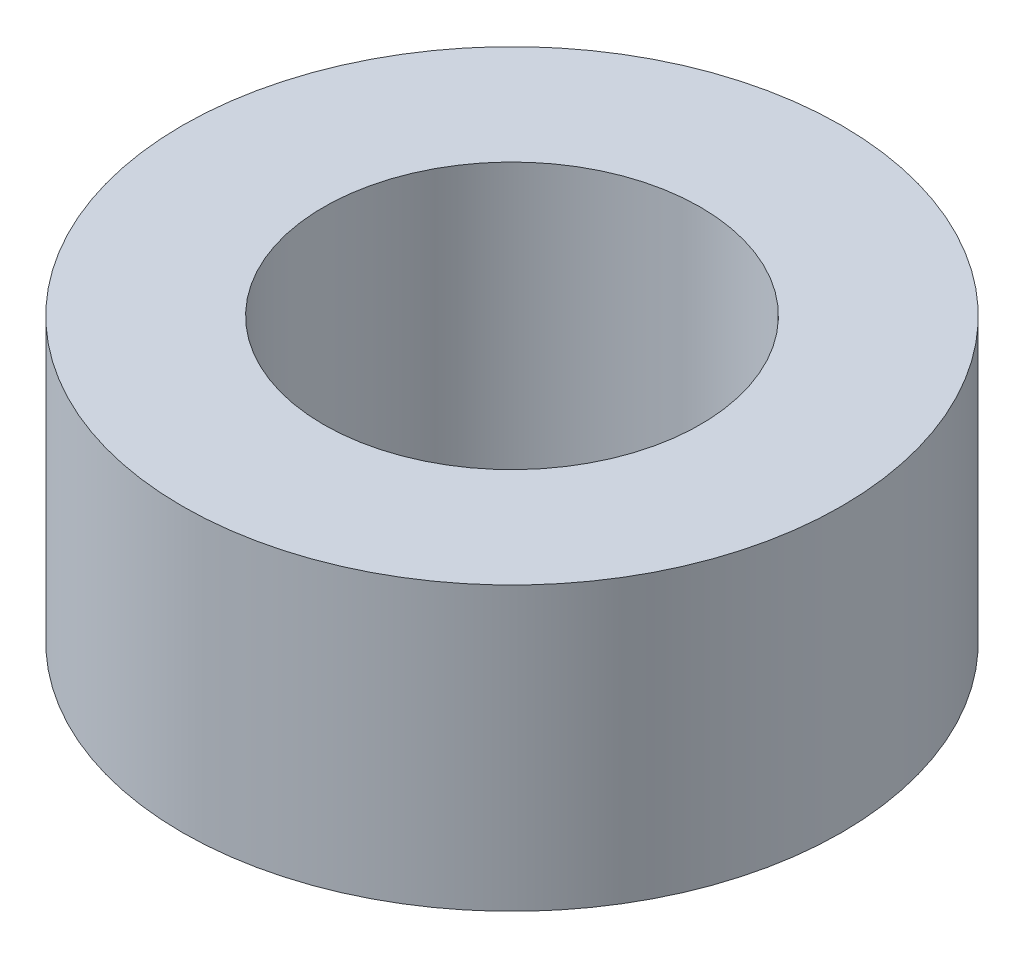
ISO-10303-21;
HEADER;
FILE_DESCRIPTION(('STEP AP214'),'2;1');
FILE_NAME('part.step','',(''),(''),'','','');
FILE_SCHEMA(('AUTOMOTIVE_DESIGN { 1 0 10303 214 1 1 1 1 }'));
ENDSEC;
DATA;
#1=APPLICATION_CONTEXT('core data for automotive mechanical design processes');
#2=APPLICATION_PROTOCOL_DEFINITION('international standard','automotive_design',2000,#1);
#3=PRODUCT_CONTEXT('',#1,'mechanical');
#4=PRODUCT('Part','Part','',(#3));
#5=PRODUCT_RELATED_PRODUCT_CATEGORY('part','',(#4));
#6=PRODUCT_DEFINITION_FORMATION('','',#4);
#7=PRODUCT_DEFINITION_CONTEXT('part definition',#1,'design');
#8=PRODUCT_DEFINITION('design','',#6,#7);
#9=PRODUCT_DEFINITION_SHAPE('','',#8);
#10=(LENGTH_UNIT() NAMED_UNIT(*) SI_UNIT(.MILLI.,.METRE.));
#11=(NAMED_UNIT(*) PLANE_ANGLE_UNIT() SI_UNIT($,.RADIAN.));
#12=(NAMED_UNIT(*) SI_UNIT($,.STERADIAN.) SOLID_ANGLE_UNIT());
#13=UNCERTAINTY_MEASURE_WITH_UNIT(LENGTH_MEASURE(1.E-05),#10,'distance_accuracy_value','');
#14=(GEOMETRIC_REPRESENTATION_CONTEXT(3) GLOBAL_UNCERTAINTY_ASSIGNED_CONTEXT((#13)) GLOBAL_UNIT_ASSIGNED_CONTEXT((#10,
#11,#12)) REPRESENTATION_CONTEXT('',''));
#15=CARTESIAN_POINT('',(0.,0.,0.));
#16=DIRECTION('',(0.,0.,1.));
#17=DIRECTION('',(1.,0.,0.));
#18=AXIS2_PLACEMENT_3D('',#15,#16,#17);
#19=CARTESIAN_POINT('',(0.,3.,0.));
#20=DIRECTION('',(0.,1.,0.));
#21=DIRECTION('',(0.,0.,1.));
#22=AXIS2_PLACEMENT_3D('',#19,#20,#21);
#23=PLANE('',#22);
#24=CARTESIAN_POINT('',(0.,3.,0.));
#25=DIRECTION('',(0.,1.,0.));
#26=DIRECTION('',(0.,0.,1.));
#27=AXIS2_PLACEMENT_3D('',#24,#25,#26);
#28=CIRCLE('',#27,3.5);
#29=CARTESIAN_POINT('',(0.,3.,3.5));
#30=VERTEX_POINT('',#29);
#31=EDGE_CURVE('E10',#30,#30,#28,.T.);
#32=ORIENTED_EDGE('',*,*,#31,.T.);
#33=EDGE_LOOP('',(#32));
#34=FACE_BOUND('',#33,.T.);
#35=CARTESIAN_POINT('',(0.,3.,0.));
#36=DIRECTION('',(0.,1.,0.));
#37=DIRECTION('',(0.,0.,1.));
#38=AXIS2_PLACEMENT_3D('',#35,#36,#37);
#39=CIRCLE('',#38,2.);
#40=CARTESIAN_POINT('',(0.,3.,2.));
#41=VERTEX_POINT('',#40);
#42=EDGE_CURVE('E44',#41,#41,#39,.T.);
#43=ORIENTED_EDGE('',*,*,#42,.F.);
#44=EDGE_LOOP('',(#43));
#45=FACE_BOUND('',#44,.T.);
#46=ADVANCED_FACE('F33',(#34,#45),#23,.T.);
#47=CARTESIAN_POINT('',(0.,0.,0.));
#48=DIRECTION('',(0.,1.,0.));
#49=DIRECTION('',(0.,0.,1.));
#50=AXIS2_PLACEMENT_3D('',#47,#48,#49);
#51=PLANE('',#50);
#52=CARTESIAN_POINT('',(0.,0.,0.));
#53=DIRECTION('',(0.,1.,0.));
#54=DIRECTION('',(0.,0.,1.));
#55=AXIS2_PLACEMENT_3D('',#52,#53,#54);
#56=CIRCLE('',#55,3.5);
#57=CARTESIAN_POINT('',(0.,0.,3.5));
#58=VERTEX_POINT('',#57);
#59=EDGE_CURVE('E37',#58,#58,#56,.T.);
#60=ORIENTED_EDGE('',*,*,#59,.F.);
#61=EDGE_LOOP('',(#60));
#62=FACE_BOUND('',#61,.T.);
#63=CARTESIAN_POINT('',(0.,0.,0.));
#64=DIRECTION('',(0.,1.,0.));
#65=DIRECTION('',(0.,0.,1.));
#66=AXIS2_PLACEMENT_3D('',#63,#64,#65);
#67=CIRCLE('',#66,2.);
#68=CARTESIAN_POINT('',(0.,0.,2.));
#69=VERTEX_POINT('',#68);
#70=EDGE_CURVE('E46',#69,#69,#67,.T.);
#71=ORIENTED_EDGE('',*,*,#70,.T.);
#72=EDGE_LOOP('',(#71));
#73=FACE_BOUND('',#72,.T.);
#74=ADVANCED_FACE('F56',(#62,#73),#51,.F.);
#75=CARTESIAN_POINT('',(0.,3.,0.));
#76=DIRECTION('',(0.,-1.,0.));
#77=DIRECTION('',(0.,0.,-1.));
#78=AXIS2_PLACEMENT_3D('',#75,#76,#77);
#79=CYLINDRICAL_SURFACE('',#78,3.5);
#80=ORIENTED_EDGE('',*,*,#31,.F.);
#81=EDGE_LOOP('',(#80));
#82=FACE_BOUND('',#81,.T.);
#83=ORIENTED_EDGE('',*,*,#59,.T.);
#84=EDGE_LOOP('',(#83));
#85=FACE_BOUND('',#84,.T.);
#86=ADVANCED_FACE('F35',(#82,#85),#79,.T.);
#87=CARTESIAN_POINT('',(0.,3.,0.));
#88=DIRECTION('',(0.,-1.,0.));
#89=DIRECTION('',(0.,0.,-1.));
#90=AXIS2_PLACEMENT_3D('',#87,#88,#89);
#91=CYLINDRICAL_SURFACE('',#90,2.);
#92=ORIENTED_EDGE('',*,*,#42,.T.);
#93=EDGE_LOOP('',(#92));
#94=FACE_BOUND('',#93,.T.);
#95=ORIENTED_EDGE('',*,*,#70,.F.);
#96=EDGE_LOOP('',(#95));
#97=FACE_BOUND('',#96,.T.);
#98=ADVANCED_FACE('F52',(#94,#97),#91,.F.);
#99=CLOSED_SHELL('',(#46,#74,#86,#98));
#100=MANIFOLD_SOLID_BREP('B2',#99);
#101=ADVANCED_BREP_SHAPE_REPRESENTATION('',(#18,#100),#14);
#102=SHAPE_DEFINITION_REPRESENTATION(#9,#101);
ENDSEC;
END-ISO-10303-21;
